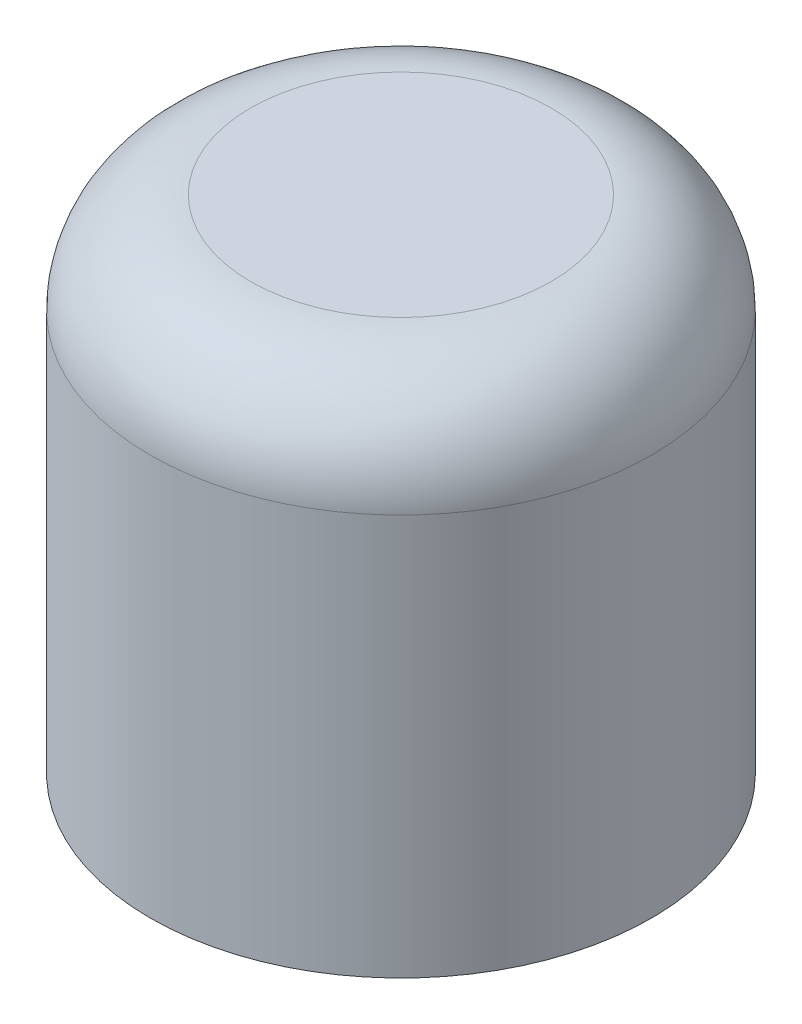
ISO-10303-21;
HEADER;
FILE_DESCRIPTION(('STEP AP214'),'2;1');
FILE_NAME('part.step','',(''),(''),'','','');
FILE_SCHEMA(('AUTOMOTIVE_DESIGN { 1 0 10303 214 1 1 1 1 }'));
ENDSEC;
DATA;
#1=APPLICATION_CONTEXT('core data for automotive mechanical design processes');
#2=APPLICATION_PROTOCOL_DEFINITION('international standard','automotive_design',2000,#1);
#3=PRODUCT_CONTEXT('',#1,'mechanical');
#4=PRODUCT('Part','Part','',(#3));
#5=PRODUCT_RELATED_PRODUCT_CATEGORY('part','',(#4));
#6=PRODUCT_DEFINITION_FORMATION('','',#4);
#7=PRODUCT_DEFINITION_CONTEXT('part definition',#1,'design');
#8=PRODUCT_DEFINITION('design','',#6,#7);
#9=PRODUCT_DEFINITION_SHAPE('','',#8);
#10=(LENGTH_UNIT() NAMED_UNIT(*) SI_UNIT(.MILLI.,.METRE.));
#11=(NAMED_UNIT(*) PLANE_ANGLE_UNIT() SI_UNIT($,.RADIAN.));
#12=(NAMED_UNIT(*) SI_UNIT($,.STERADIAN.) SOLID_ANGLE_UNIT());
#13=UNCERTAINTY_MEASURE_WITH_UNIT(LENGTH_MEASURE(1.E-05),#10,'distance_accuracy_value','');
#14=(GEOMETRIC_REPRESENTATION_CONTEXT(3) GLOBAL_UNCERTAINTY_ASSIGNED_CONTEXT((#13)) GLOBAL_UNIT_ASSIGNED_CONTEXT((#10,
#11,#12)) REPRESENTATION_CONTEXT('',''));
#15=CARTESIAN_POINT('',(0.,0.,0.));
#16=DIRECTION('',(0.,0.,1.));
#17=DIRECTION('',(1.,0.,0.));
#18=AXIS2_PLACEMENT_3D('',#15,#16,#17);
#19=CARTESIAN_POINT('',(0.,100.,0.));
#20=DIRECTION('',(0.,-1.,0.));
#21=DIRECTION('',(0.,0.,-1.));
#22=AXIS2_PLACEMENT_3D('',#19,#20,#21);
#23=CYLINDRICAL_SURFACE('',#22,50.);
#24=CARTESIAN_POINT('',(0.,80.,0.));
#25=DIRECTION('',(0.,1.,0.));
#26=DIRECTION('',(0.,0.,1.));
#27=AXIS2_PLACEMENT_3D('',#24,#25,#26);
#28=CIRCLE('',#27,50.);
#29=CARTESIAN_POINT('',(0.,80.,50.));
#30=VERTEX_POINT('',#29);
#31=EDGE_CURVE('E10',#30,#30,#28,.F.);
#32=ORIENTED_EDGE('',*,*,#31,.T.);
#33=EDGE_LOOP('',(#32));
#34=FACE_BOUND('',#33,.T.);
#35=CARTESIAN_POINT('',(0.,0.,0.));
#36=DIRECTION('',(0.,1.,0.));
#37=DIRECTION('',(0.,0.,1.));
#38=AXIS2_PLACEMENT_3D('',#35,#36,#37);
#39=CIRCLE('',#38,50.);
#40=CARTESIAN_POINT('',(0.,0.,50.));
#41=VERTEX_POINT('',#40);
#42=EDGE_CURVE('E43',#41,#41,#39,.T.);
#43=ORIENTED_EDGE('',*,*,#42,.T.);
#44=EDGE_LOOP('',(#43));
#45=FACE_BOUND('',#44,.T.);
#46=ADVANCED_FACE('F32',(#34,#45),#23,.T.);
#47=CARTESIAN_POINT('',(0.,100.,0.));
#48=DIRECTION('',(0.,1.,0.));
#49=DIRECTION('',(0.,0.,1.));
#50=AXIS2_PLACEMENT_3D('',#47,#48,#49);
#51=PLANE('',#50);
#52=CARTESIAN_POINT('',(0.,100.,0.));
#53=DIRECTION('',(0.,1.,0.));
#54=DIRECTION('',(0.,0.,1.));
#55=AXIS2_PLACEMENT_3D('',#52,#53,#54);
#56=CIRCLE('',#55,30.);
#57=CARTESIAN_POINT('',(0.,100.,30.));
#58=VERTEX_POINT('',#57);
#59=EDGE_CURVE('E39',#58,#58,#56,.T.);
#60=ORIENTED_EDGE('',*,*,#59,.T.);
#61=EDGE_LOOP('',(#60));
#62=FACE_BOUND('',#61,.T.);
#63=ADVANCED_FACE('F67',(#62),#51,.T.);
#64=CARTESIAN_POINT('',(0.,0.,0.));
#65=DIRECTION('',(0.,1.,0.));
#66=DIRECTION('',(0.,0.,1.));
#67=AXIS2_PLACEMENT_3D('',#64,#65,#66);
#68=PLANE('',#67);
#69=CARTESIAN_POINT('',(0.,0.,0.));
#70=DIRECTION('',(0.,-1.,0.));
#71=DIRECTION('',(0.,0.,-1.));
#72=AXIS2_PLACEMENT_3D('',#69,#70,#71);
#73=CIRCLE('',#72,45.);
#74=CARTESIAN_POINT('',(0.,0.,-45.));
#75=VERTEX_POINT('',#74);
#76=EDGE_CURVE('E50',#75,#75,#73,.T.);
#77=ORIENTED_EDGE('',*,*,#76,.F.);
#78=EDGE_LOOP('',(#77));
#79=FACE_BOUND('',#78,.T.);
#80=ORIENTED_EDGE('',*,*,#42,.F.);
#81=EDGE_LOOP('',(#80));
#82=FACE_BOUND('',#81,.T.);
#83=ADVANCED_FACE('F64',(#79,#82),#68,.F.);
#84=CARTESIAN_POINT('',(0.,80.,0.));
#85=DIRECTION('',(0.,1.,0.));
#86=DIRECTION('',(0.,0.,1.));
#87=AXIS2_PLACEMENT_3D('',#84,#85,#86);
#88=TOROIDAL_SURFACE('',#87,30.,20.);
#89=ORIENTED_EDGE('',*,*,#31,.F.);
#90=EDGE_LOOP('',(#89));
#91=FACE_BOUND('',#90,.T.);
#92=ORIENTED_EDGE('',*,*,#59,.F.);
#93=EDGE_LOOP('',(#92));
#94=FACE_BOUND('',#93,.T.);
#95=ADVANCED_FACE('F34',(#91,#94),#88,.T.);
#96=CARTESIAN_POINT('',(0.,80.,0.));
#97=DIRECTION('',(0.,-1.,0.));
#98=DIRECTION('',(0.,0.,-1.));
#99=AXIS2_PLACEMENT_3D('',#96,#97,#98);
#100=CYLINDRICAL_SURFACE('',#99,45.);
#101=CARTESIAN_POINT('',(0.,80.,0.));
#102=DIRECTION('',(0.,-1.,0.));
#103=DIRECTION('',(0.,0.,-1.));
#104=AXIS2_PLACEMENT_3D('',#101,#102,#103);
#105=CIRCLE('',#104,45.);
#106=CARTESIAN_POINT('',(0.,80.,-45.));
#107=VERTEX_POINT('',#106);
#108=EDGE_CURVE('E47',#107,#107,#105,.T.);
#109=ORIENTED_EDGE('',*,*,#108,.F.);
#110=EDGE_LOOP('',(#109));
#111=FACE_BOUND('',#110,.T.);
#112=ORIENTED_EDGE('',*,*,#76,.T.);
#113=EDGE_LOOP('',(#112));
#114=FACE_BOUND('',#113,.T.);
#115=ADVANCED_FACE('F58',(#111,#114),#100,.F.);
#116=CARTESIAN_POINT('',(0.,80.,0.));
#117=DIRECTION('',(0.,-1.,0.));
#118=DIRECTION('',(0.,0.,-1.));
#119=AXIS2_PLACEMENT_3D('',#116,#117,#118);
#120=PLANE('',#119);
#121=ORIENTED_EDGE('',*,*,#108,.T.);
#122=EDGE_LOOP('',(#121));
#123=FACE_BOUND('',#122,.T.);
#124=ADVANCED_FACE('F56',(#123),#120,.T.);
#125=CLOSED_SHELL('',(#46,#63,#83,#95,#115,#124));
#126=MANIFOLD_SOLID_BREP('B2',#125);
#127=ADVANCED_BREP_SHAPE_REPRESENTATION('',(#18,#126),#14);
#128=SHAPE_DEFINITION_REPRESENTATION(#9,#127);
ENDSEC;
END-ISO-10303-21;
